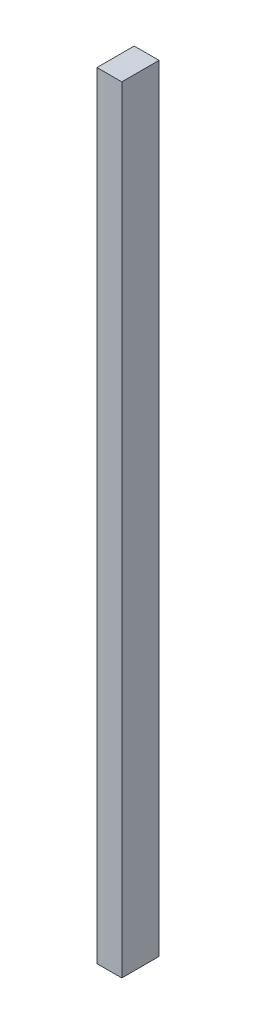
ISO-10303-21;
HEADER;
FILE_DESCRIPTION(('STEP AP214'),'2;1');
FILE_NAME('part.step','',(''),(''),'','','');
FILE_SCHEMA(('AUTOMOTIVE_DESIGN { 1 0 10303 214 1 1 1 1 }'));
ENDSEC;
DATA;
#1=APPLICATION_CONTEXT('core data for automotive mechanical design processes');
#2=APPLICATION_PROTOCOL_DEFINITION('international standard','automotive_design',2000,#1);
#3=PRODUCT_CONTEXT('',#1,'mechanical');
#4=PRODUCT('Part','Part','',(#3));
#5=PRODUCT_RELATED_PRODUCT_CATEGORY('part','',(#4));
#6=PRODUCT_DEFINITION_FORMATION('','',#4);
#7=PRODUCT_DEFINITION_CONTEXT('part definition',#1,'design');
#8=PRODUCT_DEFINITION('design','',#6,#7);
#9=PRODUCT_DEFINITION_SHAPE('','',#8);
#10=(LENGTH_UNIT() NAMED_UNIT(*) SI_UNIT(.MILLI.,.METRE.));
#11=(NAMED_UNIT(*) PLANE_ANGLE_UNIT() SI_UNIT($,.RADIAN.));
#12=(NAMED_UNIT(*) SI_UNIT($,.STERADIAN.) SOLID_ANGLE_UNIT());
#13=UNCERTAINTY_MEASURE_WITH_UNIT(LENGTH_MEASURE(1.E-05),#10,'distance_accuracy_value','');
#14=(GEOMETRIC_REPRESENTATION_CONTEXT(3) GLOBAL_UNCERTAINTY_ASSIGNED_CONTEXT((#13)) GLOBAL_UNIT_ASSIGNED_CONTEXT((#10,
#11,#12)) REPRESENTATION_CONTEXT('',''));
#15=CARTESIAN_POINT('',(0.,0.,0.));
#16=DIRECTION('',(0.,0.,1.));
#17=DIRECTION('',(1.,0.,0.));
#18=AXIS2_PLACEMENT_3D('',#15,#16,#17);
#19=CARTESIAN_POINT('',(4.,250.,6.));
#20=DIRECTION('',(-1.,0.,0.));
#21=DIRECTION('',(0.,0.,1.));
#22=AXIS2_PLACEMENT_3D('',#19,#20,#21);
#23=PLANE('',#22);
#24=DIRECTION('',(0.,0.,-1.));
#25=VECTOR('',#24,1.);
#26=CARTESIAN_POINT('',(4.,0.,6.));
#27=LINE('',#26,#25);
#28=CARTESIAN_POINT('',(4.,0.,6.));
#29=VERTEX_POINT('',#28);
#30=CARTESIAN_POINT('',(4.,0.,-6.));
#31=VERTEX_POINT('',#30);
#32=EDGE_CURVE('E96',#29,#31,#27,.T.);
#33=ORIENTED_EDGE('',*,*,#32,.T.);
#34=DIRECTION('',(0.,-1.,0.));
#35=VECTOR('',#34,1.);
#36=CARTESIAN_POINT('',(4.,250.,-6.));
#37=LINE('',#36,#35);
#38=CARTESIAN_POINT('',(4.,250.,-6.));
#39=VERTEX_POINT('',#38);
#40=EDGE_CURVE('E11',#39,#31,#37,.T.);
#41=ORIENTED_EDGE('',*,*,#40,.F.);
#42=DIRECTION('',(0.,0.,-1.));
#43=VECTOR('',#42,1.);
#44=CARTESIAN_POINT('',(4.,250.,6.));
#45=LINE('',#44,#43);
#46=CARTESIAN_POINT('',(4.,250.,6.));
#47=VERTEX_POINT('',#46);
#48=EDGE_CURVE('E84',#47,#39,#45,.T.);
#49=ORIENTED_EDGE('',*,*,#48,.F.);
#50=DIRECTION('',(0.,-1.,0.));
#51=VECTOR('',#50,1.);
#52=CARTESIAN_POINT('',(4.,250.,6.));
#53=LINE('',#52,#51);
#54=EDGE_CURVE('E92',#47,#29,#53,.T.);
#55=ORIENTED_EDGE('',*,*,#54,.T.);
#56=EDGE_LOOP('',(#33,#41,#49,#55));
#57=FACE_BOUND('',#56,.T.);
#58=ADVANCED_FACE('F33',(#57),#23,.F.);
#59=CARTESIAN_POINT('',(-4.,250.,-6.));
#60=DIRECTION('',(0.,0.,1.));
#61=DIRECTION('',(1.,0.,0.));
#62=AXIS2_PLACEMENT_3D('',#59,#60,#61);
#63=PLANE('',#62);
#64=DIRECTION('',(-1.,0.,0.));
#65=VECTOR('',#64,1.);
#66=CARTESIAN_POINT('',(-4.,0.,-6.));
#67=LINE('',#66,#65);
#68=CARTESIAN_POINT('',(-4.,0.,-6.));
#69=VERTEX_POINT('',#68);
#70=EDGE_CURVE('E88',#31,#69,#67,.T.);
#71=ORIENTED_EDGE('',*,*,#70,.T.);
#72=DIRECTION('',(0.,-1.,0.));
#73=VECTOR('',#72,1.);
#74=CARTESIAN_POINT('',(-4.,250.,-6.));
#75=LINE('',#74,#73);
#76=CARTESIAN_POINT('',(-4.,250.,-6.));
#77=VERTEX_POINT('',#76);
#78=EDGE_CURVE('E41',#77,#69,#75,.T.);
#79=ORIENTED_EDGE('',*,*,#78,.F.);
#80=DIRECTION('',(-1.,0.,0.));
#81=VECTOR('',#80,1.);
#82=CARTESIAN_POINT('',(-4.,250.,-6.));
#83=LINE('',#82,#81);
#84=EDGE_CURVE('E79',#39,#77,#83,.T.);
#85=ORIENTED_EDGE('',*,*,#84,.F.);
#86=ORIENTED_EDGE('',*,*,#40,.T.);
#87=EDGE_LOOP('',(#71,#79,#85,#86));
#88=FACE_BOUND('',#87,.T.);
#89=ADVANCED_FACE('F87',(#88),#63,.F.);
#90=CARTESIAN_POINT('',(-4.,250.,6.));
#91=DIRECTION('',(1.,0.,0.));
#92=DIRECTION('',(0.,0.,-1.));
#93=AXIS2_PLACEMENT_3D('',#90,#91,#92);
#94=PLANE('',#93);
#95=DIRECTION('',(0.,0.,1.));
#96=VECTOR('',#95,1.);
#97=CARTESIAN_POINT('',(-4.,0.,6.));
#98=LINE('',#97,#96);
#99=CARTESIAN_POINT('',(-4.,0.,6.));
#100=VERTEX_POINT('',#99);
#101=EDGE_CURVE('E66',#69,#100,#98,.T.);
#102=ORIENTED_EDGE('',*,*,#101,.T.);
#103=DIRECTION('',(0.,-1.,0.));
#104=VECTOR('',#103,1.);
#105=CARTESIAN_POINT('',(-4.,250.,6.));
#106=LINE('',#105,#104);
#107=CARTESIAN_POINT('',(-4.,250.,6.));
#108=VERTEX_POINT('',#107);
#109=EDGE_CURVE('E89',#108,#100,#106,.T.);
#110=ORIENTED_EDGE('',*,*,#109,.F.);
#111=DIRECTION('',(0.,0.,1.));
#112=VECTOR('',#111,1.);
#113=CARTESIAN_POINT('',(-4.,250.,6.));
#114=LINE('',#113,#112);
#115=EDGE_CURVE('E82',#77,#108,#114,.T.);
#116=ORIENTED_EDGE('',*,*,#115,.F.);
#117=ORIENTED_EDGE('',*,*,#78,.T.);
#118=EDGE_LOOP('',(#102,#110,#116,#117));
#119=FACE_BOUND('',#118,.T.);
#120=ADVANCED_FACE('F90',(#119),#94,.F.);
#121=CARTESIAN_POINT('',(-4.,250.,6.));
#122=DIRECTION('',(0.,0.,-1.));
#123=DIRECTION('',(-1.,0.,0.));
#124=AXIS2_PLACEMENT_3D('',#121,#122,#123);
#125=PLANE('',#124);
#126=DIRECTION('',(1.,0.,0.));
#127=VECTOR('',#126,1.);
#128=CARTESIAN_POINT('',(-4.,0.,6.));
#129=LINE('',#128,#127);
#130=EDGE_CURVE('E72',#100,#29,#129,.T.);
#131=ORIENTED_EDGE('',*,*,#130,.T.);
#132=ORIENTED_EDGE('',*,*,#54,.F.);
#133=DIRECTION('',(1.,0.,0.));
#134=VECTOR('',#133,1.);
#135=CARTESIAN_POINT('',(-4.,250.,6.));
#136=LINE('',#135,#134);
#137=EDGE_CURVE('E49',#108,#47,#136,.T.);
#138=ORIENTED_EDGE('',*,*,#137,.F.);
#139=ORIENTED_EDGE('',*,*,#109,.T.);
#140=EDGE_LOOP('',(#131,#132,#138,#139));
#141=FACE_BOUND('',#140,.T.);
#142=ADVANCED_FACE('F103',(#141),#125,.F.);
#143=CARTESIAN_POINT('',(0.,250.,0.));
#144=DIRECTION('',(0.,-1.,0.));
#145=DIRECTION('',(0.,0.,-1.));
#146=AXIS2_PLACEMENT_3D('',#143,#144,#145);
#147=PLANE('',#146);
#148=ORIENTED_EDGE('',*,*,#48,.T.);
#149=ORIENTED_EDGE('',*,*,#84,.T.);
#150=ORIENTED_EDGE('',*,*,#115,.T.);
#151=ORIENTED_EDGE('',*,*,#137,.T.);
#152=EDGE_LOOP('',(#148,#149,#150,#151));
#153=FACE_BOUND('',#152,.T.);
#154=ADVANCED_FACE('F80',(#153),#147,.F.);
#155=CARTESIAN_POINT('',(0.,0.,0.));
#156=DIRECTION('',(0.,-1.,0.));
#157=DIRECTION('',(0.,0.,-1.));
#158=AXIS2_PLACEMENT_3D('',#155,#156,#157);
#159=PLANE('',#158);
#160=ORIENTED_EDGE('',*,*,#32,.F.);
#161=ORIENTED_EDGE('',*,*,#130,.F.);
#162=ORIENTED_EDGE('',*,*,#101,.F.);
#163=ORIENTED_EDGE('',*,*,#70,.F.);
#164=EDGE_LOOP('',(#160,#161,#162,#163));
#165=FACE_BOUND('',#164,.T.);
#166=ADVANCED_FACE('F106',(#165),#159,.T.);
#167=CLOSED_SHELL('',(#58,#89,#120,#142,#154,#166));
#168=MANIFOLD_SOLID_BREP('B2',#167);
#169=ADVANCED_BREP_SHAPE_REPRESENTATION('',(#18,#168),#14);
#170=SHAPE_DEFINITION_REPRESENTATION(#9,#169);
ENDSEC;
END-ISO-10303-21;
